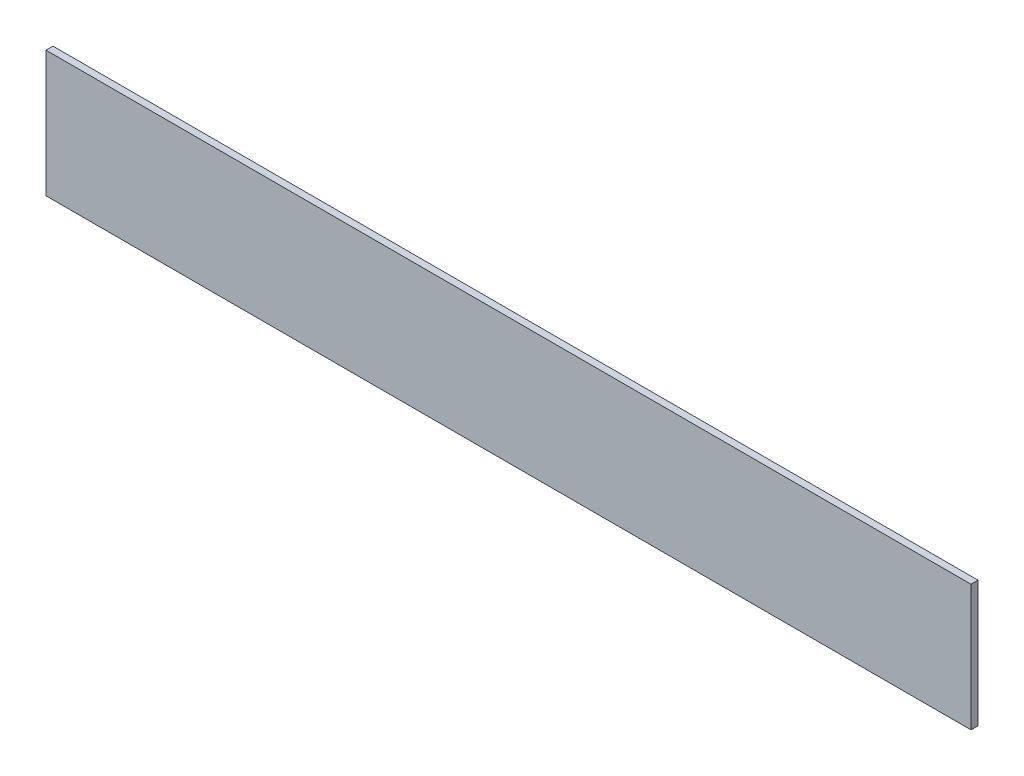
ISO-10303-21;
HEADER;
FILE_DESCRIPTION(('STEP AP214'),'2;1');
FILE_NAME('part.step','',(''),(''),'','','');
FILE_SCHEMA(('AUTOMOTIVE_DESIGN { 1 0 10303 214 1 1 1 1 }'));
ENDSEC;
DATA;
#1=APPLICATION_CONTEXT('core data for automotive mechanical design processes');
#2=APPLICATION_PROTOCOL_DEFINITION('international standard','automotive_design',2000,#1);
#3=PRODUCT_CONTEXT('',#1,'mechanical');
#4=PRODUCT('Part','Part','',(#3));
#5=PRODUCT_RELATED_PRODUCT_CATEGORY('part','',(#4));
#6=PRODUCT_DEFINITION_FORMATION('','',#4);
#7=PRODUCT_DEFINITION_CONTEXT('part definition',#1,'design');
#8=PRODUCT_DEFINITION('design','',#6,#7);
#9=PRODUCT_DEFINITION_SHAPE('','',#8);
#10=(LENGTH_UNIT() NAMED_UNIT(*) SI_UNIT(.MILLI.,.METRE.));
#11=(NAMED_UNIT(*) PLANE_ANGLE_UNIT() SI_UNIT($,.RADIAN.));
#12=(NAMED_UNIT(*) SI_UNIT($,.STERADIAN.) SOLID_ANGLE_UNIT());
#13=UNCERTAINTY_MEASURE_WITH_UNIT(LENGTH_MEASURE(1.E-05),#10,'distance_accuracy_value','');
#14=(GEOMETRIC_REPRESENTATION_CONTEXT(3) GLOBAL_UNCERTAINTY_ASSIGNED_CONTEXT((#13)) GLOBAL_UNIT_ASSIGNED_CONTEXT((#10,
#11,#12)) REPRESENTATION_CONTEXT('',''));
#15=CARTESIAN_POINT('',(0.,0.,0.));
#16=DIRECTION('',(0.,0.,1.));
#17=DIRECTION('',(1.,0.,0.));
#18=AXIS2_PLACEMENT_3D('',#15,#16,#17);
#19=CARTESIAN_POINT('',(185.,552.,-237.5));
#20=DIRECTION('',(-1.,0.,0.));
#21=DIRECTION('',(0.,0.,1.));
#22=AXIS2_PLACEMENT_3D('',#19,#20,#21);
#23=PLANE('',#22);
#24=DIRECTION('',(0.,-1.,0.));
#25=VECTOR('',#24,1.);
#26=CARTESIAN_POINT('',(185.,552.,-235.));
#27=LINE('',#26,#25);
#28=CARTESIAN_POINT('',(185.,597.,-235.));
#29=VERTEX_POINT('',#28);
#30=CARTESIAN_POINT('',(185.,552.,-235.));
#31=VERTEX_POINT('',#30);
#32=EDGE_CURVE('E103',#29,#31,#27,.T.);
#33=ORIENTED_EDGE('',*,*,#32,.F.);
#34=DIRECTION('',(0.,0.,1.));
#35=VECTOR('',#34,1.);
#36=CARTESIAN_POINT('',(185.,597.,-237.5));
#37=LINE('',#36,#35);
#38=CARTESIAN_POINT('',(185.,597.,-237.5));
#39=VERTEX_POINT('',#38);
#40=EDGE_CURVE('E11',#39,#29,#37,.T.);
#41=ORIENTED_EDGE('',*,*,#40,.F.);
#42=DIRECTION('',(0.,-1.,0.));
#43=VECTOR('',#42,1.);
#44=CARTESIAN_POINT('',(185.,552.,-237.5));
#45=LINE('',#44,#43);
#46=CARTESIAN_POINT('',(185.,552.,-237.5));
#47=VERTEX_POINT('',#46);
#48=EDGE_CURVE('E97',#39,#47,#45,.T.);
#49=ORIENTED_EDGE('',*,*,#48,.T.);
#50=DIRECTION('',(0.,0.,1.));
#51=VECTOR('',#50,1.);
#52=CARTESIAN_POINT('',(185.,552.,-237.5));
#53=LINE('',#52,#51);
#54=EDGE_CURVE('E42',#47,#31,#53,.T.);
#55=ORIENTED_EDGE('',*,*,#54,.T.);
#56=EDGE_LOOP('',(#33,#41,#49,#55));
#57=FACE_BOUND('',#56,.T.);
#58=ADVANCED_FACE('F39',(#57),#23,.T.);
#59=CARTESIAN_POINT('',(185.,597.,-237.5));
#60=DIRECTION('',(0.,1.,0.));
#61=DIRECTION('',(0.,0.,1.));
#62=AXIS2_PLACEMENT_3D('',#59,#60,#61);
#63=PLANE('',#62);
#64=DIRECTION('',(-1.,0.,0.));
#65=VECTOR('',#64,1.);
#66=CARTESIAN_POINT('',(185.,597.,-235.));
#67=LINE('',#66,#65);
#68=CARTESIAN_POINT('',(515.,597.,-235.));
#69=VERTEX_POINT('',#68);
#70=EDGE_CURVE('E99',#69,#29,#67,.T.);
#71=ORIENTED_EDGE('',*,*,#70,.F.);
#72=DIRECTION('',(0.,0.,1.));
#73=VECTOR('',#72,1.);
#74=CARTESIAN_POINT('',(515.,597.,-237.5));
#75=LINE('',#74,#73);
#76=CARTESIAN_POINT('',(515.,597.,-237.5));
#77=VERTEX_POINT('',#76);
#78=EDGE_CURVE('E48',#77,#69,#75,.T.);
#79=ORIENTED_EDGE('',*,*,#78,.F.);
#80=DIRECTION('',(-1.,0.,0.));
#81=VECTOR('',#80,1.);
#82=CARTESIAN_POINT('',(185.,597.,-237.5));
#83=LINE('',#82,#81);
#84=EDGE_CURVE('E94',#77,#39,#83,.T.);
#85=ORIENTED_EDGE('',*,*,#84,.T.);
#86=ORIENTED_EDGE('',*,*,#40,.T.);
#87=EDGE_LOOP('',(#71,#79,#85,#86));
#88=FACE_BOUND('',#87,.T.);
#89=ADVANCED_FACE('F113',(#88),#63,.T.);
#90=CARTESIAN_POINT('',(515.,552.,-237.5));
#91=DIRECTION('',(1.,0.,0.));
#92=DIRECTION('',(0.,0.,-1.));
#93=AXIS2_PLACEMENT_3D('',#90,#91,#92);
#94=PLANE('',#93);
#95=DIRECTION('',(0.,1.,0.));
#96=VECTOR('',#95,1.);
#97=CARTESIAN_POINT('',(515.,552.,-235.));
#98=LINE('',#97,#96);
#99=CARTESIAN_POINT('',(515.,552.,-235.));
#100=VERTEX_POINT('',#99);
#101=EDGE_CURVE('E89',#100,#69,#98,.T.);
#102=ORIENTED_EDGE('',*,*,#101,.F.);
#103=DIRECTION('',(0.,0.,1.));
#104=VECTOR('',#103,1.);
#105=CARTESIAN_POINT('',(515.,552.,-237.5));
#106=LINE('',#105,#104);
#107=CARTESIAN_POINT('',(515.,552.,-237.5));
#108=VERTEX_POINT('',#107);
#109=EDGE_CURVE('E84',#108,#100,#106,.T.);
#110=ORIENTED_EDGE('',*,*,#109,.F.);
#111=DIRECTION('',(0.,1.,0.));
#112=VECTOR('',#111,1.);
#113=CARTESIAN_POINT('',(515.,552.,-237.5));
#114=LINE('',#113,#112);
#115=EDGE_CURVE('E87',#108,#77,#114,.T.);
#116=ORIENTED_EDGE('',*,*,#115,.T.);
#117=ORIENTED_EDGE('',*,*,#78,.T.);
#118=EDGE_LOOP('',(#102,#110,#116,#117));
#119=FACE_BOUND('',#118,.T.);
#120=ADVANCED_FACE('F86',(#119),#94,.T.);
#121=CARTESIAN_POINT('',(185.,552.,-237.5));
#122=DIRECTION('',(0.,-1.,0.));
#123=DIRECTION('',(0.,0.,-1.));
#124=AXIS2_PLACEMENT_3D('',#121,#122,#123);
#125=PLANE('',#124);
#126=DIRECTION('',(1.,0.,0.));
#127=VECTOR('',#126,1.);
#128=CARTESIAN_POINT('',(185.,552.,-235.));
#129=LINE('',#128,#127);
#130=EDGE_CURVE('E106',#31,#100,#129,.T.);
#131=ORIENTED_EDGE('',*,*,#130,.F.);
#132=ORIENTED_EDGE('',*,*,#54,.F.);
#133=DIRECTION('',(1.,0.,0.));
#134=VECTOR('',#133,1.);
#135=CARTESIAN_POINT('',(185.,552.,-237.5));
#136=LINE('',#135,#134);
#137=EDGE_CURVE('E93',#47,#108,#136,.T.);
#138=ORIENTED_EDGE('',*,*,#137,.T.);
#139=ORIENTED_EDGE('',*,*,#109,.T.);
#140=EDGE_LOOP('',(#131,#132,#138,#139));
#141=FACE_BOUND('',#140,.T.);
#142=ADVANCED_FACE('F96',(#141),#125,.T.);
#143=CARTESIAN_POINT('',(0.,0.,-237.5));
#144=DIRECTION('',(0.,0.,-1.));
#145=DIRECTION('',(-1.,0.,0.));
#146=AXIS2_PLACEMENT_3D('',#143,#144,#145);
#147=PLANE('',#146);
#148=ORIENTED_EDGE('',*,*,#48,.F.);
#149=ORIENTED_EDGE('',*,*,#84,.F.);
#150=ORIENTED_EDGE('',*,*,#115,.F.);
#151=ORIENTED_EDGE('',*,*,#137,.F.);
#152=EDGE_LOOP('',(#148,#149,#150,#151));
#153=FACE_BOUND('',#152,.T.);
#154=ADVANCED_FACE('F92',(#153),#147,.T.);
#155=CARTESIAN_POINT('',(0.,0.,-235.));
#156=DIRECTION('',(0.,0.,-1.));
#157=DIRECTION('',(-1.,0.,0.));
#158=AXIS2_PLACEMENT_3D('',#155,#156,#157);
#159=PLANE('',#158);
#160=ORIENTED_EDGE('',*,*,#32,.T.);
#161=ORIENTED_EDGE('',*,*,#130,.T.);
#162=ORIENTED_EDGE('',*,*,#101,.T.);
#163=ORIENTED_EDGE('',*,*,#70,.T.);
#164=EDGE_LOOP('',(#160,#161,#162,#163));
#165=FACE_BOUND('',#164,.T.);
#166=ADVANCED_FACE('F112',(#165),#159,.F.);
#167=CLOSED_SHELL('',(#58,#89,#120,#142,#154,#166));
#168=MANIFOLD_SOLID_BREP('B2',#167);
#169=ADVANCED_BREP_SHAPE_REPRESENTATION('',(#18,#168),#14);
#170=SHAPE_DEFINITION_REPRESENTATION(#9,#169);
ENDSEC;
END-ISO-10303-21;
